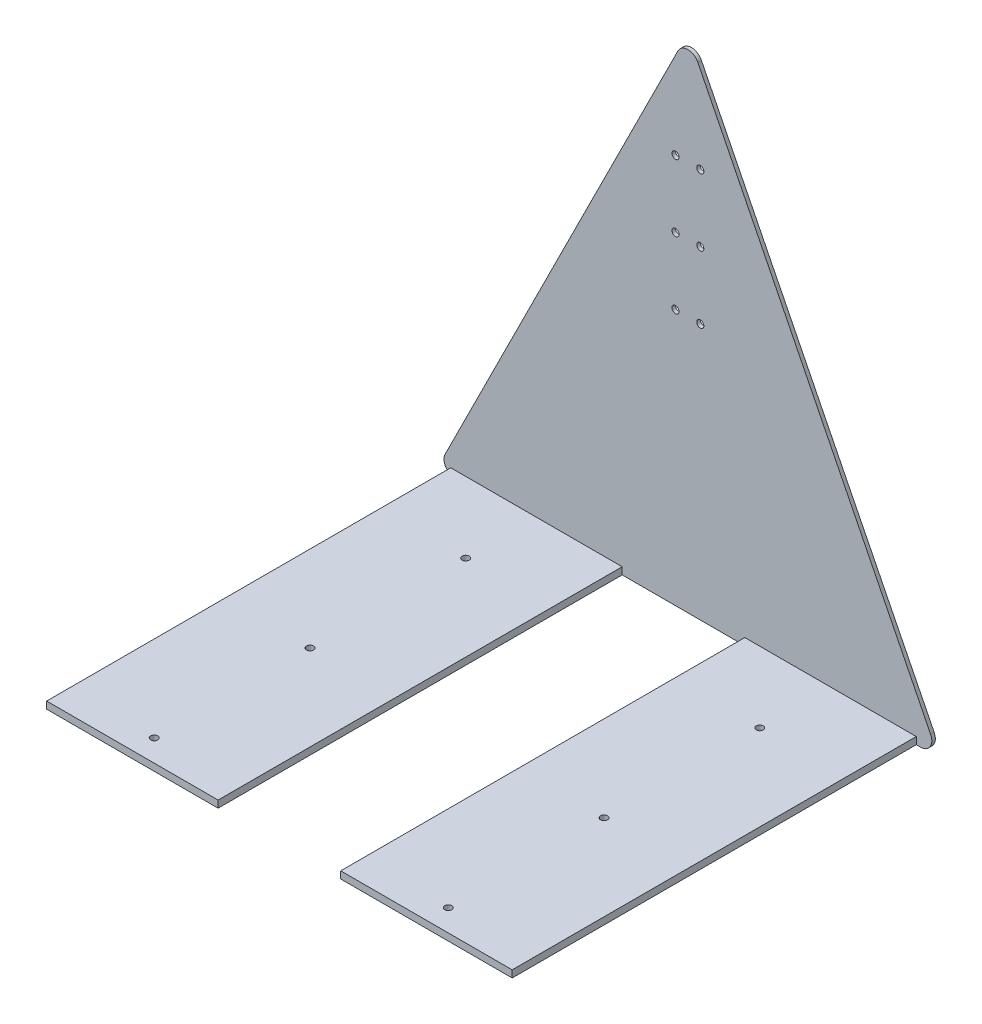
ISO-10303-21;
HEADER;
FILE_DESCRIPTION(('STEP AP214'),'2;1');
FILE_NAME('part.step','',(''),(''),'','','');
FILE_SCHEMA(('AUTOMOTIVE_DESIGN { 1 0 10303 214 1 1 1 1 }'));
ENDSEC;
DATA;
#1=APPLICATION_CONTEXT('core data for automotive mechanical design processes');
#2=APPLICATION_PROTOCOL_DEFINITION('international standard','automotive_design',2000,#1);
#3=PRODUCT_CONTEXT('',#1,'mechanical');
#4=PRODUCT('Part','Part','',(#3));
#5=PRODUCT_RELATED_PRODUCT_CATEGORY('part','',(#4));
#6=PRODUCT_DEFINITION_FORMATION('','',#4);
#7=PRODUCT_DEFINITION_CONTEXT('part definition',#1,'design');
#8=PRODUCT_DEFINITION('design','',#6,#7);
#9=PRODUCT_DEFINITION_SHAPE('','',#8);
#10=(LENGTH_UNIT() NAMED_UNIT(*) SI_UNIT(.MILLI.,.METRE.));
#11=(NAMED_UNIT(*) PLANE_ANGLE_UNIT() SI_UNIT($,.RADIAN.));
#12=(NAMED_UNIT(*) SI_UNIT($,.STERADIAN.) SOLID_ANGLE_UNIT());
#13=UNCERTAINTY_MEASURE_WITH_UNIT(LENGTH_MEASURE(1.E-05),#10,'distance_accuracy_value','');
#14=(GEOMETRIC_REPRESENTATION_CONTEXT(3) GLOBAL_UNCERTAINTY_ASSIGNED_CONTEXT((#13)) GLOBAL_UNIT_ASSIGNED_CONTEXT((#10,
#11,#12)) REPRESENTATION_CONTEXT('',''));
#15=CARTESIAN_POINT('',(0.,0.,0.));
#16=DIRECTION('',(0.,0.,1.));
#17=DIRECTION('',(1.,0.,0.));
#18=AXIS2_PLACEMENT_3D('',#15,#16,#17);
#19=CARTESIAN_POINT('',(-132.886938071488,3238.5595834706,6223.61959782082));
#20=DIRECTION('',(0.,0.,-1.));
#21=DIRECTION('',(-1.,0.,0.));
#22=AXIS2_PLACEMENT_3D('',#19,#20,#21);
#23=PLANE('',#22);
#24=CARTESIAN_POINT('',(-110.661938071488,2843.26974466307,6223.61959782082));
#25=DIRECTION('',(0.,0.,1.));
#26=DIRECTION('',(1.,0.,0.));
#27=AXIS2_PLACEMENT_3D('',#24,#25,#26);
#28=CIRCLE('',#27,6.34999999999995);
#29=CARTESIAN_POINT('',(-104.311938071488,2843.26974466307,6223.61959782082));
#30=VERTEX_POINT('',#29);
#31=EDGE_CURVE('E264',#30,#30,#28,.T.);
#32=ORIENTED_EDGE('',*,*,#31,.F.);
#33=EDGE_LOOP('',(#32));
#34=FACE_BOUND('',#33,.T.);
#35=CARTESIAN_POINT('',(-110.661938071488,2963.26974466307,6223.61959782082));
#36=DIRECTION('',(0.,0.,1.));
#37=DIRECTION('',(1.,0.,0.));
#38=AXIS2_PLACEMENT_3D('',#35,#36,#37);
#39=CIRCLE('',#38,6.34999999999995);
#40=CARTESIAN_POINT('',(-104.311938071488,2963.26974466307,6223.61959782082));
#41=VERTEX_POINT('',#40);
#42=EDGE_CURVE('E272',#41,#41,#39,.T.);
#43=ORIENTED_EDGE('',*,*,#42,.F.);
#44=EDGE_LOOP('',(#43));
#45=FACE_BOUND('',#44,.T.);
#46=CARTESIAN_POINT('',(-110.661938071488,3083.26974466307,6223.61959782082));
#47=DIRECTION('',(0.,0.,1.));
#48=DIRECTION('',(1.,0.,0.));
#49=AXIS2_PLACEMENT_3D('',#46,#47,#48);
#50=CIRCLE('',#49,6.34999999999996);
#51=CARTESIAN_POINT('',(-104.311938071488,3083.26974466307,6223.61959782082));
#52=VERTEX_POINT('',#51);
#53=EDGE_CURVE('E280',#52,#52,#50,.T.);
#54=ORIENTED_EDGE('',*,*,#53,.F.);
#55=EDGE_LOOP('',(#54));
#56=FACE_BOUND('',#55,.T.);
#57=CARTESIAN_POINT('',(-155.111938071488,3083.26974466307,6223.61959782082));
#58=DIRECTION('',(0.,0.,1.));
#59=DIRECTION('',(1.,0.,0.));
#60=AXIS2_PLACEMENT_3D('',#57,#58,#59);
#61=CIRCLE('',#60,6.34999999999997);
#62=CARTESIAN_POINT('',(-148.761938071488,3083.26974466307,6223.61959782082));
#63=VERTEX_POINT('',#62);
#64=EDGE_CURVE('E288',#63,#63,#61,.T.);
#65=ORIENTED_EDGE('',*,*,#64,.F.);
#66=EDGE_LOOP('',(#65));
#67=FACE_BOUND('',#66,.T.);
#68=CARTESIAN_POINT('',(-155.111938071488,2963.26974466307,6223.61959782082));
#69=DIRECTION('',(0.,0.,1.));
#70=DIRECTION('',(1.,0.,0.));
#71=AXIS2_PLACEMENT_3D('',#68,#69,#70);
#72=CIRCLE('',#71,6.34999999999997);
#73=CARTESIAN_POINT('',(-148.761938071488,2963.26974466307,6223.61959782082));
#74=VERTEX_POINT('',#73);
#75=EDGE_CURVE('E296',#74,#74,#72,.T.);
#76=ORIENTED_EDGE('',*,*,#75,.F.);
#77=EDGE_LOOP('',(#76));
#78=FACE_BOUND('',#77,.T.);
#79=CARTESIAN_POINT('',(-155.111938071488,2843.26974466307,6223.61959782082));
#80=DIRECTION('',(0.,0.,1.));
#81=DIRECTION('',(1.,0.,0.));
#82=AXIS2_PLACEMENT_3D('',#79,#80,#81);
#83=CIRCLE('',#82,6.34999999999999);
#84=CARTESIAN_POINT('',(-148.761938071488,2843.26974466307,6223.61959782082));
#85=VERTEX_POINT('',#84);
#86=EDGE_CURVE('E304',#85,#85,#83,.T.);
#87=ORIENTED_EDGE('',*,*,#86,.F.);
#88=EDGE_LOOP('',(#87));
#89=FACE_BOUND('',#88,.T.);
#90=DIRECTION('',(1.,0.,0.));
#91=VECTOR('',#90,1.);
#92=CARTESIAN_POINT('',(276.840185721219,2395.96974466307,6223.61959782082));
#93=LINE('',#92,#91);
#94=CARTESIAN_POINT('',(-30.799814278781,2395.96974466307,6223.61959782082));
#95=VERTEX_POINT('',#94);
#96=CARTESIAN_POINT('',(276.840185721219,2395.96974466307,6223.61959782082));
#97=VERTEX_POINT('',#96);
#98=EDGE_CURVE('E60',#95,#97,#93,.T.);
#99=ORIENTED_EDGE('',*,*,#98,.T.);
#100=DIRECTION('',(0.,-1.,0.));
#101=VECTOR('',#100,1.);
#102=CARTESIAN_POINT('',(276.840185721219,2395.96974466307,6223.61959782082));
#103=LINE('',#102,#101);
#104=CARTESIAN_POINT('',(276.840185721219,2383.26974466307,6223.61959782082));
#105=VERTEX_POINT('',#104);
#106=EDGE_CURVE('E166',#97,#105,#103,.T.);
#107=ORIENTED_EDGE('',*,*,#106,.T.);
#108=DIRECTION('',(1.,0.,0.));
#109=VECTOR('',#108,1.);
#110=CARTESIAN_POINT('',(-550.504061864195,2383.26974466307,6223.61959782082));
#111=LINE('',#110,#109);
#112=CARTESIAN_POINT('',(284.730185721219,2383.26974466307,6223.61959782082));
#113=VERTEX_POINT('',#112);
#114=EDGE_CURVE('E325',#105,#113,#111,.T.);
#115=ORIENTED_EDGE('',*,*,#114,.T.);
#116=CARTESIAN_POINT('',(284.730185721219,2403.26974466307,6223.61959782082));
#117=DIRECTION('',(0.,0.,1.));
#118=DIRECTION('',(1.,0.,0.));
#119=AXIS2_PLACEMENT_3D('',#116,#117,#118);
#120=CIRCLE('',#119,20.);
#121=CARTESIAN_POINT('',(302.618967646059,2412.21354034754,6223.61959782082));
#122=VERTEX_POINT('',#121);
#123=EDGE_CURVE('E329',#113,#122,#120,.T.);
#124=ORIENTED_EDGE('',*,*,#123,.T.);
#125=DIRECTION('',(-0.4471897842234,0.894439096242013,0.));
#126=VECTOR('',#125,1.);
#127=CARTESIAN_POINT('',(302.618967646059,2412.21354034754,6223.61959782082));
#128=LINE('',#127,#126);
#129=CARTESIAN_POINT('',(-114.998156146648,3247.50337915507,6223.61959782082));
#130=VERTEX_POINT('',#129);
#131=EDGE_CURVE('E332',#122,#130,#128,.T.);
#132=ORIENTED_EDGE('',*,*,#131,.T.);
#133=CARTESIAN_POINT('',(-132.886938071488,3238.5595834706,6223.61959782082));
#134=DIRECTION('',(0.,0.,1.));
#135=DIRECTION('',(-1.,0.,0.));
#136=AXIS2_PLACEMENT_3D('',#133,#134,#135);
#137=CIRCLE('',#136,19.9999999999999);
#138=CARTESIAN_POINT('',(-150.775719996328,3247.50337915507,6223.61959782082));
#139=VERTEX_POINT('',#138);
#140=EDGE_CURVE('E312',#130,#139,#137,.T.);
#141=ORIENTED_EDGE('',*,*,#140,.T.);
#142=DIRECTION('',(-0.4471897842234,-0.894439096242013,0.));
#143=VECTOR('',#142,1.);
#144=CARTESIAN_POINT('',(-150.775719996328,3247.50337915507,6223.61959782082));
#145=LINE('',#144,#143);
#146=CARTESIAN_POINT('',(-568.392843789035,2412.21354034754,6223.61959782082));
#147=VERTEX_POINT('',#146);
#148=EDGE_CURVE('E316',#139,#147,#145,.T.);
#149=ORIENTED_EDGE('',*,*,#148,.T.);
#150=CARTESIAN_POINT('',(-550.504061864195,2403.26974466307,6223.61959782082));
#151=DIRECTION('',(0.,0.,1.));
#152=DIRECTION('',(-1.,0.,0.));
#153=AXIS2_PLACEMENT_3D('',#150,#151,#152);
#154=CIRCLE('',#153,19.9999999999999);
#155=CARTESIAN_POINT('',(-558.439814278781,2384.91153577401,6223.61959782082));
#156=VERTEX_POINT('',#155);
#157=EDGE_CURVE('E321',#147,#156,#154,.T.);
#158=ORIENTED_EDGE('',*,*,#157,.T.);
#159=DIRECTION('',(0.,-1.,0.));
#160=VECTOR('',#159,1.);
#161=CARTESIAN_POINT('',(-558.439814278781,2395.96974466307,6223.61959782082));
#162=LINE('',#161,#160);
#163=CARTESIAN_POINT('',(-558.439814278781,2395.96974466307,6223.61959782082));
#164=VERTEX_POINT('',#163);
#165=EDGE_CURVE('E254',#164,#156,#162,.T.);
#166=ORIENTED_EDGE('',*,*,#165,.F.);
#167=DIRECTION('',(1.,0.,0.));
#168=VECTOR('',#167,1.);
#169=CARTESIAN_POINT('',(-250.799814278781,2395.96974466307,6223.61959782082));
#170=LINE('',#169,#168);
#171=CARTESIAN_POINT('',(-250.799814278781,2395.96974466307,6223.61959782082));
#172=VERTEX_POINT('',#171);
#173=EDGE_CURVE('E230',#164,#172,#170,.T.);
#174=ORIENTED_EDGE('',*,*,#173,.T.);
#175=DIRECTION('',(0.,-1.,0.));
#176=VECTOR('',#175,1.);
#177=CARTESIAN_POINT('',(-250.799814278781,2395.96974466307,6223.61959782082));
#178=LINE('',#177,#176);
#179=CARTESIAN_POINT('',(-250.799814278781,2383.26974466307,6223.61959782082));
#180=VERTEX_POINT('',#179);
#181=EDGE_CURVE('E249',#172,#180,#178,.T.);
#182=ORIENTED_EDGE('',*,*,#181,.T.);
#183=CARTESIAN_POINT('',(-30.799814278781,2383.26974466307,6223.61959782082));
#184=VERTEX_POINT('',#183);
#185=EDGE_CURVE('E326',#180,#184,#111,.T.);
#186=ORIENTED_EDGE('',*,*,#185,.T.);
#187=DIRECTION('',(0.,-1.,0.));
#188=VECTOR('',#187,1.);
#189=CARTESIAN_POINT('',(-30.799814278781,2395.96974466307,6223.61959782082));
#190=LINE('',#189,#188);
#191=EDGE_CURVE('E55',#95,#184,#190,.T.);
#192=ORIENTED_EDGE('',*,*,#191,.F.);
#193=EDGE_LOOP('',(#99,#107,#115,#124,#132,#141,#149,#158,#166,#174,#182,#186,#192));
#194=FACE_BOUND('',#193,.T.);
#195=ADVANCED_FACE('F39',(#34,#45,#56,#67,#78,#89,#194),#23,.F.);
#196=CARTESIAN_POINT('',(-132.886938071488,3238.5595834706,6217.26959782082));
#197=DIRECTION('',(0.,0.,-1.));
#198=DIRECTION('',(-1.,0.,0.));
#199=AXIS2_PLACEMENT_3D('',#196,#197,#198);
#200=PLANE('',#199);
#201=CARTESIAN_POINT('',(-110.661938071488,2963.26974466307,6217.26959782082));
#202=DIRECTION('',(0.,0.,1.));
#203=DIRECTION('',(1.,0.,0.));
#204=AXIS2_PLACEMENT_3D('',#201,#202,#203);
#205=CIRCLE('',#204,6.34999999999995);
#206=CARTESIAN_POINT('',(-104.311938071488,2963.26974466307,6217.26959782082));
#207=VERTEX_POINT('',#206);
#208=EDGE_CURVE('E268',#207,#207,#205,.T.);
#209=ORIENTED_EDGE('',*,*,#208,.T.);
#210=EDGE_LOOP('',(#209));
#211=FACE_BOUND('',#210,.T.);
#212=CARTESIAN_POINT('',(-155.111938071488,3083.26974466307,6217.26959782082));
#213=DIRECTION('',(0.,0.,1.));
#214=DIRECTION('',(1.,0.,0.));
#215=AXIS2_PLACEMENT_3D('',#212,#213,#214);
#216=CIRCLE('',#215,6.34999999999997);
#217=CARTESIAN_POINT('',(-148.761938071488,3083.26974466307,6217.26959782082));
#218=VERTEX_POINT('',#217);
#219=EDGE_CURVE('E284',#218,#218,#216,.T.);
#220=ORIENTED_EDGE('',*,*,#219,.T.);
#221=EDGE_LOOP('',(#220));
#222=FACE_BOUND('',#221,.T.);
#223=CARTESIAN_POINT('',(-155.111938071488,2843.26974466307,6217.26959782082));
#224=DIRECTION('',(0.,0.,1.));
#225=DIRECTION('',(1.,0.,0.));
#226=AXIS2_PLACEMENT_3D('',#223,#224,#225);
#227=CIRCLE('',#226,6.34999999999999);
#228=CARTESIAN_POINT('',(-148.761938071488,2843.26974466307,6217.26959782082));
#229=VERTEX_POINT('',#228);
#230=EDGE_CURVE('E300',#229,#229,#227,.T.);
#231=ORIENTED_EDGE('',*,*,#230,.T.);
#232=EDGE_LOOP('',(#231));
#233=FACE_BOUND('',#232,.T.);
#234=CARTESIAN_POINT('',(-132.886938071488,3238.5595834706,6217.26959782082));
#235=DIRECTION('',(0.,0.,1.));
#236=DIRECTION('',(-1.,0.,0.));
#237=AXIS2_PLACEMENT_3D('',#234,#235,#236);
#238=CIRCLE('',#237,19.9999999999999);
#239=CARTESIAN_POINT('',(-114.998156146648,3247.50337915507,6217.26959782082));
#240=VERTEX_POINT('',#239);
#241=CARTESIAN_POINT('',(-150.775719996328,3247.50337915507,6217.26959782082));
#242=VERTEX_POINT('',#241);
#243=EDGE_CURVE('E308',#240,#242,#238,.T.);
#244=ORIENTED_EDGE('',*,*,#243,.F.);
#245=DIRECTION('',(-0.4471897842234,0.894439096242013,0.));
#246=VECTOR('',#245,1.);
#247=CARTESIAN_POINT('',(302.618967646059,2412.21354034754,6217.26959782082));
#248=LINE('',#247,#246);
#249=CARTESIAN_POINT('',(302.618967646059,2412.21354034754,6217.26959782082));
#250=VERTEX_POINT('',#249);
#251=EDGE_CURVE('E317',#250,#240,#248,.T.);
#252=ORIENTED_EDGE('',*,*,#251,.F.);
#253=CARTESIAN_POINT('',(284.730185721219,2403.26974466307,6217.26959782082));
#254=DIRECTION('',(0.,0.,1.));
#255=DIRECTION('',(1.,0.,0.));
#256=AXIS2_PLACEMENT_3D('',#253,#254,#255);
#257=CIRCLE('',#256,20.);
#258=CARTESIAN_POINT('',(284.730185721219,2383.26974466307,6217.26959782082));
#259=VERTEX_POINT('',#258);
#260=EDGE_CURVE('E348',#259,#250,#257,.T.);
#261=ORIENTED_EDGE('',*,*,#260,.F.);
#262=DIRECTION('',(1.,0.,0.));
#263=VECTOR('',#262,1.);
#264=CARTESIAN_POINT('',(-550.504061864195,2383.26974466307,6217.26959782082));
#265=LINE('',#264,#263);
#266=CARTESIAN_POINT('',(-550.504061864195,2383.26974466307,6217.26959782082));
#267=VERTEX_POINT('',#266);
#268=EDGE_CURVE('E345',#267,#259,#265,.T.);
#269=ORIENTED_EDGE('',*,*,#268,.F.);
#270=CARTESIAN_POINT('',(-550.504061864195,2403.26974466307,6217.26959782082));
#271=DIRECTION('',(0.,0.,1.));
#272=DIRECTION('',(-1.,0.,0.));
#273=AXIS2_PLACEMENT_3D('',#270,#271,#272);
#274=CIRCLE('',#273,19.9999999999999);
#275=CARTESIAN_POINT('',(-568.392843789035,2412.21354034754,6217.26959782082));
#276=VERTEX_POINT('',#275);
#277=EDGE_CURVE('E342',#276,#267,#274,.T.);
#278=ORIENTED_EDGE('',*,*,#277,.F.);
#279=DIRECTION('',(-0.4471897842234,-0.894439096242013,0.));
#280=VECTOR('',#279,1.);
#281=CARTESIAN_POINT('',(-150.775719996328,3247.50337915507,6217.26959782082));
#282=LINE('',#281,#280);
#283=EDGE_CURVE('E339',#242,#276,#282,.T.);
#284=ORIENTED_EDGE('',*,*,#283,.F.);
#285=EDGE_LOOP('',(#244,#252,#261,#269,#278,#284));
#286=FACE_BOUND('',#285,.T.);
#287=CARTESIAN_POINT('',(-155.111938071488,2963.26974466307,6217.26959782082));
#288=DIRECTION('',(0.,0.,1.));
#289=DIRECTION('',(1.,0.,0.));
#290=AXIS2_PLACEMENT_3D('',#287,#288,#289);
#291=CIRCLE('',#290,6.34999999999997);
#292=CARTESIAN_POINT('',(-148.761938071488,2963.26974466307,6217.26959782082));
#293=VERTEX_POINT('',#292);
#294=EDGE_CURVE('E292',#293,#293,#291,.T.);
#295=ORIENTED_EDGE('',*,*,#294,.T.);
#296=EDGE_LOOP('',(#295));
#297=FACE_BOUND('',#296,.T.);
#298=CARTESIAN_POINT('',(-110.661938071488,3083.26974466307,6217.26959782082));
#299=DIRECTION('',(0.,0.,1.));
#300=DIRECTION('',(1.,0.,0.));
#301=AXIS2_PLACEMENT_3D('',#298,#299,#300);
#302=CIRCLE('',#301,6.34999999999996);
#303=CARTESIAN_POINT('',(-104.311938071488,3083.26974466307,6217.26959782082));
#304=VERTEX_POINT('',#303);
#305=EDGE_CURVE('E276',#304,#304,#302,.T.);
#306=ORIENTED_EDGE('',*,*,#305,.T.);
#307=EDGE_LOOP('',(#306));
#308=FACE_BOUND('',#307,.T.);
#309=CARTESIAN_POINT('',(-110.661938071488,2843.26974466307,6217.26959782082));
#310=DIRECTION('',(0.,0.,1.));
#311=DIRECTION('',(1.,0.,0.));
#312=AXIS2_PLACEMENT_3D('',#309,#310,#311);
#313=CIRCLE('',#312,6.34999999999995);
#314=CARTESIAN_POINT('',(-104.311938071488,2843.26974466307,6217.26959782082));
#315=VERTEX_POINT('',#314);
#316=EDGE_CURVE('E253',#315,#315,#313,.T.);
#317=ORIENTED_EDGE('',*,*,#316,.T.);
#318=EDGE_LOOP('',(#317));
#319=FACE_BOUND('',#318,.T.);
#320=ADVANCED_FACE('F380',(#211,#222,#233,#286,#297,#308,#319),#200,.T.);
#321=CARTESIAN_POINT('',(-132.886938071488,3238.5595834706,6223.61959782082));
#322=DIRECTION('',(0.,0.,-1.));
#323=DIRECTION('',(-1.,0.,0.));
#324=AXIS2_PLACEMENT_3D('',#321,#322,#323);
#325=CYLINDRICAL_SURFACE('',#324,19.9999999999999);
#326=ORIENTED_EDGE('',*,*,#243,.T.);
#327=DIRECTION('',(0.,0.,-1.));
#328=VECTOR('',#327,1.);
#329=CARTESIAN_POINT('',(-150.775719996328,3247.50337915507,6223.61959782082));
#330=LINE('',#329,#328);
#331=EDGE_CURVE('E11',#139,#242,#330,.T.);
#332=ORIENTED_EDGE('',*,*,#331,.F.);
#333=ORIENTED_EDGE('',*,*,#140,.F.);
#334=DIRECTION('',(0.,0.,-1.));
#335=VECTOR('',#334,1.);
#336=CARTESIAN_POINT('',(-114.998156146648,3247.50337915507,6223.61959782082));
#337=LINE('',#336,#335);
#338=EDGE_CURVE('E335',#130,#240,#337,.T.);
#339=ORIENTED_EDGE('',*,*,#338,.T.);
#340=EDGE_LOOP('',(#326,#332,#333,#339));
#341=FACE_BOUND('',#340,.T.);
#342=ADVANCED_FACE('F41',(#341),#325,.T.);
#343=CARTESIAN_POINT('',(-150.775719996328,3247.50337915507,6223.61959782082));
#344=DIRECTION('',(0.894439096242013,-0.4471897842234,0.));
#345=DIRECTION('',(0.4471897842234,0.894439096242013,0.));
#346=AXIS2_PLACEMENT_3D('',#343,#344,#345);
#347=PLANE('',#346);
#348=ORIENTED_EDGE('',*,*,#283,.T.);
#349=DIRECTION('',(0.,0.,-1.));
#350=VECTOR('',#349,1.);
#351=CARTESIAN_POINT('',(-568.392843789035,2412.21354034754,6223.61959782082));
#352=LINE('',#351,#350);
#353=EDGE_CURVE('E48',#147,#276,#352,.T.);
#354=ORIENTED_EDGE('',*,*,#353,.F.);
#355=ORIENTED_EDGE('',*,*,#148,.F.);
#356=ORIENTED_EDGE('',*,*,#331,.T.);
#357=EDGE_LOOP('',(#348,#354,#355,#356));
#358=FACE_BOUND('',#357,.T.);
#359=ADVANCED_FACE('F407',(#358),#347,.F.);
#360=CARTESIAN_POINT('',(-550.504061864195,2403.26974466307,6223.61959782082));
#361=DIRECTION('',(0.,0.,-1.));
#362=DIRECTION('',(-1.,0.,0.));
#363=AXIS2_PLACEMENT_3D('',#360,#361,#362);
#364=CYLINDRICAL_SURFACE('',#363,19.9999999999999);
#365=ORIENTED_EDGE('',*,*,#277,.T.);
#366=DIRECTION('',(0.,0.,-1.));
#367=VECTOR('',#366,1.);
#368=CARTESIAN_POINT('',(-550.504061864195,2383.26974466307,6223.61959782082));
#369=LINE('',#368,#367);
#370=CARTESIAN_POINT('',(-550.504061864195,2383.26974466307,6223.61959782082));
#371=VERTEX_POINT('',#370);
#372=EDGE_CURVE('E364',#371,#267,#369,.T.);
#373=ORIENTED_EDGE('',*,*,#372,.F.);
#374=EDGE_CURVE('E320',#156,#371,#154,.T.);
#375=ORIENTED_EDGE('',*,*,#374,.F.);
#376=ORIENTED_EDGE('',*,*,#157,.F.);
#377=ORIENTED_EDGE('',*,*,#353,.T.);
#378=EDGE_LOOP('',(#365,#373,#375,#376,#377));
#379=FACE_BOUND('',#378,.T.);
#380=ADVANCED_FACE('F373',(#379),#364,.T.);
#381=CARTESIAN_POINT('',(-550.504061864195,2383.26974466307,6223.61959782082));
#382=DIRECTION('',(0.,1.,0.));
#383=DIRECTION('',(0.,0.,1.));
#384=AXIS2_PLACEMENT_3D('',#381,#382,#383);
#385=PLANE('',#384);
#386=ORIENTED_EDGE('',*,*,#268,.T.);
#387=DIRECTION('',(0.,0.,-1.));
#388=VECTOR('',#387,1.);
#389=CARTESIAN_POINT('',(284.730185721219,2383.26974466307,6223.61959782082));
#390=LINE('',#389,#388);
#391=EDGE_CURVE('E360',#113,#259,#390,.T.);
#392=ORIENTED_EDGE('',*,*,#391,.F.);
#393=ORIENTED_EDGE('',*,*,#114,.F.);
#394=DIRECTION('',(0.,0.,1.));
#395=VECTOR('',#394,1.);
#396=CARTESIAN_POINT('',(276.840185721219,2383.26974466307,6223.61959782082));
#397=LINE('',#396,#395);
#398=CARTESIAN_POINT('',(276.840185721219,2383.26974466307,6948.61959782082));
#399=VERTEX_POINT('',#398);
#400=EDGE_CURVE('E181',#105,#399,#397,.T.);
#401=ORIENTED_EDGE('',*,*,#400,.T.);
#402=DIRECTION('',(-1.,0.,0.));
#403=VECTOR('',#402,1.);
#404=CARTESIAN_POINT('',(276.840185721219,2383.26974466307,6948.61959782082));
#405=LINE('',#404,#403);
#406=CARTESIAN_POINT('',(-30.799814278781,2383.26974466307,6948.61959782082));
#407=VERTEX_POINT('',#406);
#408=EDGE_CURVE('E149',#399,#407,#405,.T.);
#409=ORIENTED_EDGE('',*,*,#408,.T.);
#410=DIRECTION('',(0.,0.,-1.));
#411=VECTOR('',#410,1.);
#412=CARTESIAN_POINT('',(-30.799814278781,2383.26974466307,6223.61959782082));
#413=LINE('',#412,#411);
#414=EDGE_CURVE('E168',#407,#184,#413,.T.);
#415=ORIENTED_EDGE('',*,*,#414,.T.);
#416=ORIENTED_EDGE('',*,*,#185,.F.);
#417=DIRECTION('',(0.,0.,1.));
#418=VECTOR('',#417,1.);
#419=CARTESIAN_POINT('',(-250.799814278781,2383.26974466307,6223.61959782082));
#420=LINE('',#419,#418);
#421=CARTESIAN_POINT('',(-250.799814278781,2383.26974466307,6948.61959782082));
#422=VERTEX_POINT('',#421);
#423=EDGE_CURVE('E214',#180,#422,#420,.T.);
#424=ORIENTED_EDGE('',*,*,#423,.T.);
#425=DIRECTION('',(-1.,0.,0.));
#426=VECTOR('',#425,1.);
#427=CARTESIAN_POINT('',(-250.799814278781,2383.26974466307,6948.61959782082));
#428=LINE('',#427,#426);
#429=CARTESIAN_POINT('',(-558.439814278781,2383.26974466307,6948.61959782082));
#430=VERTEX_POINT('',#429);
#431=EDGE_CURVE('E238',#422,#430,#428,.T.);
#432=ORIENTED_EDGE('',*,*,#431,.T.);
#433=DIRECTION('',(0.,0.,-1.));
#434=VECTOR('',#433,1.);
#435=CARTESIAN_POINT('',(-558.439814278781,2383.26974466307,6223.61959782082));
#436=LINE('',#435,#434);
#437=CARTESIAN_POINT('',(-558.439814278781,2383.26974466307,6223.61959782082));
#438=VERTEX_POINT('',#437);
#439=EDGE_CURVE('E242',#430,#438,#436,.T.);
#440=ORIENTED_EDGE('',*,*,#439,.T.);
#441=DIRECTION('',(1.,0.,0.));
#442=VECTOR('',#441,1.);
#443=CARTESIAN_POINT('',(-250.799814278781,2383.26974466307,6223.61959782082));
#444=LINE('',#443,#442);
#445=EDGE_CURVE('E223',#438,#371,#444,.T.);
#446=ORIENTED_EDGE('',*,*,#445,.T.);
#447=ORIENTED_EDGE('',*,*,#372,.T.);
#448=EDGE_LOOP('',(#386,#392,#393,#401,#409,#415,#416,#424,#432,#440,#446,#447));
#449=FACE_BOUND('',#448,.T.);
#450=CARTESIAN_POINT('',(-404.619814278781,2383.26974466307,6350.61959782082));
#451=DIRECTION('',(0.,-1.,0.));
#452=DIRECTION('',(0.,0.,-1.));
#453=AXIS2_PLACEMENT_3D('',#450,#451,#452);
#454=CIRCLE('',#453,6.35000000000006);
#455=CARTESIAN_POINT('',(-404.619814278781,2383.26974466307,6344.26959782082));
#456=VERTEX_POINT('',#455);
#457=EDGE_CURVE('E189',#456,#456,#454,.T.);
#458=ORIENTED_EDGE('',*,*,#457,.F.);
#459=EDGE_LOOP('',(#458));
#460=FACE_BOUND('',#459,.T.);
#461=CARTESIAN_POINT('',(-404.619814278781,2383.26974466307,6630.01959782082));
#462=DIRECTION('',(0.,-1.,0.));
#463=DIRECTION('',(0.,0.,-1.));
#464=AXIS2_PLACEMENT_3D('',#461,#462,#463);
#465=CIRCLE('',#464,6.35000000000001);
#466=CARTESIAN_POINT('',(-404.619814278781,2383.26974466307,6623.66959782082));
#467=VERTEX_POINT('',#466);
#468=EDGE_CURVE('E198',#467,#467,#465,.T.);
#469=ORIENTED_EDGE('',*,*,#468,.F.);
#470=EDGE_LOOP('',(#469));
#471=FACE_BOUND('',#470,.T.);
#472=CARTESIAN_POINT('',(-404.619814278781,2383.26974466307,6909.41959782082));
#473=DIRECTION('',(0.,-1.,0.));
#474=DIRECTION('',(0.,0.,-1.));
#475=AXIS2_PLACEMENT_3D('',#472,#473,#474);
#476=CIRCLE('',#475,6.35000000000001);
#477=CARTESIAN_POINT('',(-404.619814278781,2383.26974466307,6903.06959782082));
#478=VERTEX_POINT('',#477);
#479=EDGE_CURVE('E206',#478,#478,#476,.T.);
#480=ORIENTED_EDGE('',*,*,#479,.F.);
#481=EDGE_LOOP('',(#480));
#482=FACE_BOUND('',#481,.T.);
#483=CARTESIAN_POINT('',(123.020185721219,2383.26974466307,6350.61959782082));
#484=DIRECTION('',(0.,-1.,0.));
#485=DIRECTION('',(0.,0.,-1.));
#486=AXIS2_PLACEMENT_3D('',#483,#484,#485);
#487=CIRCLE('',#486,6.35000000000006);
#488=CARTESIAN_POINT('',(123.020185721219,2383.26974466307,6344.26959782082));
#489=VERTEX_POINT('',#488);
#490=EDGE_CURVE('E510',#489,#489,#487,.T.);
#491=ORIENTED_EDGE('',*,*,#490,.F.);
#492=EDGE_LOOP('',(#491));
#493=FACE_BOUND('',#492,.T.);
#494=CARTESIAN_POINT('',(123.020185721219,2383.26974466307,6630.01959782082));
#495=DIRECTION('',(0.,-1.,0.));
#496=DIRECTION('',(0.,0.,-1.));
#497=AXIS2_PLACEMENT_3D('',#494,#495,#496);
#498=CIRCLE('',#497,6.35000000000001);
#499=CARTESIAN_POINT('',(123.020185721219,2383.26974466307,6623.66959782082));
#500=VERTEX_POINT('',#499);
#501=EDGE_CURVE('E515',#500,#500,#498,.T.);
#502=ORIENTED_EDGE('',*,*,#501,.F.);
#503=EDGE_LOOP('',(#502));
#504=FACE_BOUND('',#503,.T.);
#505=CARTESIAN_POINT('',(123.020185721219,2383.26974466307,6909.41959782082));
#506=DIRECTION('',(0.,-1.,0.));
#507=DIRECTION('',(0.,0.,-1.));
#508=AXIS2_PLACEMENT_3D('',#505,#506,#507);
#509=CIRCLE('',#508,6.35000000000001);
#510=CARTESIAN_POINT('',(123.020185721219,2383.26974466307,6903.06959782082));
#511=VERTEX_POINT('',#510);
#512=EDGE_CURVE('E174',#511,#511,#509,.T.);
#513=ORIENTED_EDGE('',*,*,#512,.F.);
#514=EDGE_LOOP('',(#513));
#515=FACE_BOUND('',#514,.T.);
#516=ADVANCED_FACE('F386',(#449,#460,#471,#482,#493,#504,#515),#385,.F.);
#517=CARTESIAN_POINT('',(284.730185721219,2403.26974466307,6223.61959782082));
#518=DIRECTION('',(0.,0.,-1.));
#519=DIRECTION('',(-1.,0.,0.));
#520=AXIS2_PLACEMENT_3D('',#517,#518,#519);
#521=CYLINDRICAL_SURFACE('',#520,20.);
#522=ORIENTED_EDGE('',*,*,#260,.T.);
#523=DIRECTION('',(0.,0.,-1.));
#524=VECTOR('',#523,1.);
#525=CARTESIAN_POINT('',(302.618967646059,2412.21354034754,6223.61959782082));
#526=LINE('',#525,#524);
#527=EDGE_CURVE('E356',#122,#250,#526,.T.);
#528=ORIENTED_EDGE('',*,*,#527,.F.);
#529=ORIENTED_EDGE('',*,*,#123,.F.);
#530=ORIENTED_EDGE('',*,*,#391,.T.);
#531=EDGE_LOOP('',(#522,#528,#529,#530));
#532=FACE_BOUND('',#531,.T.);
#533=ADVANCED_FACE('F390',(#532),#521,.T.);
#534=CARTESIAN_POINT('',(302.618967646059,2412.21354034754,6223.61959782082));
#535=DIRECTION('',(-0.894439096242013,-0.4471897842234,0.));
#536=DIRECTION('',(0.447189784223401,-0.894439096242013,0.));
#537=AXIS2_PLACEMENT_3D('',#534,#535,#536);
#538=PLANE('',#537);
#539=ORIENTED_EDGE('',*,*,#251,.T.);
#540=ORIENTED_EDGE('',*,*,#338,.F.);
#541=ORIENTED_EDGE('',*,*,#131,.F.);
#542=ORIENTED_EDGE('',*,*,#527,.T.);
#543=EDGE_LOOP('',(#539,#540,#541,#542));
#544=FACE_BOUND('',#543,.T.);
#545=ADVANCED_FACE('F410',(#544),#538,.F.);
#546=CARTESIAN_POINT('',(-155.111938071488,2843.26974466307,6223.61959782082));
#547=DIRECTION('',(0.,0.,-1.));
#548=DIRECTION('',(-1.,0.,0.));
#549=AXIS2_PLACEMENT_3D('',#546,#547,#548);
#550=CYLINDRICAL_SURFACE('',#549,6.34999999999999);
#551=ORIENTED_EDGE('',*,*,#86,.T.);
#552=EDGE_LOOP('',(#551));
#553=FACE_BOUND('',#552,.T.);
#554=ORIENTED_EDGE('',*,*,#230,.F.);
#555=EDGE_LOOP('',(#554));
#556=FACE_BOUND('',#555,.T.);
#557=ADVANCED_FACE('F412',(#553,#556),#550,.F.);
#558=CARTESIAN_POINT('',(-155.111938071488,2963.26974466307,6223.61959782082));
#559=DIRECTION('',(0.,0.,-1.));
#560=DIRECTION('',(-1.,0.,0.));
#561=AXIS2_PLACEMENT_3D('',#558,#559,#560);
#562=CYLINDRICAL_SURFACE('',#561,6.34999999999997);
#563=ORIENTED_EDGE('',*,*,#75,.T.);
#564=EDGE_LOOP('',(#563));
#565=FACE_BOUND('',#564,.T.);
#566=ORIENTED_EDGE('',*,*,#294,.F.);
#567=EDGE_LOOP('',(#566));
#568=FACE_BOUND('',#567,.T.);
#569=ADVANCED_FACE('F418',(#565,#568),#562,.F.);
#570=CARTESIAN_POINT('',(-155.111938071488,3083.26974466307,6223.61959782082));
#571=DIRECTION('',(0.,0.,-1.));
#572=DIRECTION('',(-1.,0.,0.));
#573=AXIS2_PLACEMENT_3D('',#570,#571,#572);
#574=CYLINDRICAL_SURFACE('',#573,6.34999999999997);
#575=ORIENTED_EDGE('',*,*,#64,.T.);
#576=EDGE_LOOP('',(#575));
#577=FACE_BOUND('',#576,.T.);
#578=ORIENTED_EDGE('',*,*,#219,.F.);
#579=EDGE_LOOP('',(#578));
#580=FACE_BOUND('',#579,.T.);
#581=ADVANCED_FACE('F435',(#577,#580),#574,.F.);
#582=CARTESIAN_POINT('',(-110.661938071488,3083.26974466307,6223.61959782082));
#583=DIRECTION('',(0.,0.,-1.));
#584=DIRECTION('',(-1.,0.,0.));
#585=AXIS2_PLACEMENT_3D('',#582,#583,#584);
#586=CYLINDRICAL_SURFACE('',#585,6.34999999999996);
#587=ORIENTED_EDGE('',*,*,#53,.T.);
#588=EDGE_LOOP('',(#587));
#589=FACE_BOUND('',#588,.T.);
#590=ORIENTED_EDGE('',*,*,#305,.F.);
#591=EDGE_LOOP('',(#590));
#592=FACE_BOUND('',#591,.T.);
#593=ADVANCED_FACE('F439',(#589,#592),#586,.F.);
#594=CARTESIAN_POINT('',(-110.661938071488,2963.26974466307,6223.61959782082));
#595=DIRECTION('',(0.,0.,-1.));
#596=DIRECTION('',(-1.,0.,0.));
#597=AXIS2_PLACEMENT_3D('',#594,#595,#596);
#598=CYLINDRICAL_SURFACE('',#597,6.34999999999995);
#599=ORIENTED_EDGE('',*,*,#42,.T.);
#600=EDGE_LOOP('',(#599));
#601=FACE_BOUND('',#600,.T.);
#602=ORIENTED_EDGE('',*,*,#208,.F.);
#603=EDGE_LOOP('',(#602));
#604=FACE_BOUND('',#603,.T.);
#605=ADVANCED_FACE('F443',(#601,#604),#598,.F.);
#606=CARTESIAN_POINT('',(-110.661938071488,2843.26974466307,6223.61959782082));
#607=DIRECTION('',(0.,0.,-1.));
#608=DIRECTION('',(-1.,0.,0.));
#609=AXIS2_PLACEMENT_3D('',#606,#607,#608);
#610=CYLINDRICAL_SURFACE('',#609,6.34999999999995);
#611=ORIENTED_EDGE('',*,*,#31,.T.);
#612=EDGE_LOOP('',(#611));
#613=FACE_BOUND('',#612,.T.);
#614=ORIENTED_EDGE('',*,*,#316,.F.);
#615=EDGE_LOOP('',(#614));
#616=FACE_BOUND('',#615,.T.);
#617=ADVANCED_FACE('F447',(#613,#616),#610,.F.);
#618=CARTESIAN_POINT('',(-250.799814278781,2395.96974466307,6223.61959782082));
#619=DIRECTION('',(1.,0.,0.));
#620=DIRECTION('',(0.,0.,-1.));
#621=AXIS2_PLACEMENT_3D('',#618,#619,#620);
#622=PLANE('',#621);
#623=ORIENTED_EDGE('',*,*,#423,.F.);
#624=ORIENTED_EDGE('',*,*,#181,.F.);
#625=DIRECTION('',(0.,0.,1.));
#626=VECTOR('',#625,1.);
#627=CARTESIAN_POINT('',(-250.799814278781,2395.96974466307,6223.61959782082));
#628=LINE('',#627,#626);
#629=CARTESIAN_POINT('',(-250.799814278781,2395.96974466307,6948.61959782082));
#630=VERTEX_POINT('',#629);
#631=EDGE_CURVE('E218',#172,#630,#628,.T.);
#632=ORIENTED_EDGE('',*,*,#631,.T.);
#633=DIRECTION('',(0.,-1.,0.));
#634=VECTOR('',#633,1.);
#635=CARTESIAN_POINT('',(-250.799814278781,2395.96974466307,6948.61959782082));
#636=LINE('',#635,#634);
#637=EDGE_CURVE('E234',#630,#422,#636,.T.);
#638=ORIENTED_EDGE('',*,*,#637,.T.);
#639=EDGE_LOOP('',(#623,#624,#632,#638));
#640=FACE_BOUND('',#639,.T.);
#641=ADVANCED_FACE('F451',(#640),#622,.T.);
#642=CARTESIAN_POINT('',(-250.799814278781,2395.96974466307,6223.61959782082));
#643=DIRECTION('',(0.,0.,-1.));
#644=DIRECTION('',(-1.,0.,0.));
#645=AXIS2_PLACEMENT_3D('',#642,#643,#644);
#646=PLANE('',#645);
#647=EDGE_CURVE('E258',#156,#438,#162,.T.);
#648=ORIENTED_EDGE('',*,*,#647,.F.);
#649=ORIENTED_EDGE('',*,*,#374,.T.);
#650=ORIENTED_EDGE('',*,*,#445,.F.);
#651=EDGE_LOOP('',(#648,#649,#650));
#652=FACE_BOUND('',#651,.T.);
#653=ADVANCED_FACE('F404',(#652),#646,.T.);
#654=CARTESIAN_POINT('',(-558.439814278781,2395.96974466307,6223.61959782082));
#655=DIRECTION('',(-1.,0.,0.));
#656=DIRECTION('',(0.,0.,1.));
#657=AXIS2_PLACEMENT_3D('',#654,#655,#656);
#658=PLANE('',#657);
#659=ORIENTED_EDGE('',*,*,#439,.F.);
#660=DIRECTION('',(0.,-1.,0.));
#661=VECTOR('',#660,1.);
#662=CARTESIAN_POINT('',(-558.439814278781,2395.96974466307,6948.61959782082));
#663=LINE('',#662,#661);
#664=CARTESIAN_POINT('',(-558.439814278781,2395.96974466307,6948.61959782082));
#665=VERTEX_POINT('',#664);
#666=EDGE_CURVE('E259',#665,#430,#663,.T.);
#667=ORIENTED_EDGE('',*,*,#666,.F.);
#668=DIRECTION('',(0.,0.,-1.));
#669=VECTOR('',#668,1.);
#670=CARTESIAN_POINT('',(-558.439814278781,2395.96974466307,6223.61959782082));
#671=LINE('',#670,#669);
#672=EDGE_CURVE('E227',#665,#164,#671,.T.);
#673=ORIENTED_EDGE('',*,*,#672,.T.);
#674=ORIENTED_EDGE('',*,*,#165,.T.);
#675=ORIENTED_EDGE('',*,*,#647,.T.);
#676=EDGE_LOOP('',(#659,#667,#673,#674,#675));
#677=FACE_BOUND('',#676,.T.);
#678=ADVANCED_FACE('F399',(#677),#658,.T.);
#679=CARTESIAN_POINT('',(-250.799814278781,2395.96974466307,6948.61959782082));
#680=DIRECTION('',(0.,0.,1.));
#681=DIRECTION('',(1.,0.,0.));
#682=AXIS2_PLACEMENT_3D('',#679,#680,#681);
#683=PLANE('',#682);
#684=ORIENTED_EDGE('',*,*,#431,.F.);
#685=ORIENTED_EDGE('',*,*,#637,.F.);
#686=DIRECTION('',(-1.,0.,0.));
#687=VECTOR('',#686,1.);
#688=CARTESIAN_POINT('',(-250.799814278781,2395.96974466307,6948.61959782082));
#689=LINE('',#688,#687);
#690=EDGE_CURVE('E222',#630,#665,#689,.T.);
#691=ORIENTED_EDGE('',*,*,#690,.T.);
#692=ORIENTED_EDGE('',*,*,#666,.T.);
#693=EDGE_LOOP('',(#684,#685,#691,#692));
#694=FACE_BOUND('',#693,.T.);
#695=ADVANCED_FACE('F456',(#694),#683,.T.);
#696=CARTESIAN_POINT('',(-132.886938071488,2395.96974466307,6217.26959782082));
#697=DIRECTION('',(0.,-1.,0.));
#698=DIRECTION('',(0.,0.,-1.));
#699=AXIS2_PLACEMENT_3D('',#696,#697,#698);
#700=PLANE('',#699);
#701=CARTESIAN_POINT('',(-404.619814278781,2395.96974466307,6350.61959782082));
#702=DIRECTION('',(0.,-1.,0.));
#703=DIRECTION('',(0.,0.,-1.));
#704=AXIS2_PLACEMENT_3D('',#701,#702,#703);
#705=CIRCLE('',#704,6.35000000000006);
#706=CARTESIAN_POINT('',(-404.619814278781,2395.96974466307,6344.26959782082));
#707=VERTEX_POINT('',#706);
#708=EDGE_CURVE('E194',#707,#707,#705,.T.);
#709=ORIENTED_EDGE('',*,*,#708,.T.);
#710=EDGE_LOOP('',(#709));
#711=FACE_BOUND('',#710,.T.);
#712=CARTESIAN_POINT('',(-404.619814278781,2395.96974466307,6630.01959782082));
#713=DIRECTION('',(0.,-1.,0.));
#714=DIRECTION('',(0.,0.,-1.));
#715=AXIS2_PLACEMENT_3D('',#712,#713,#714);
#716=CIRCLE('',#715,6.35000000000001);
#717=CARTESIAN_POINT('',(-404.619814278781,2395.96974466307,6623.66959782082));
#718=VERTEX_POINT('',#717);
#719=EDGE_CURVE('E202',#718,#718,#716,.T.);
#720=ORIENTED_EDGE('',*,*,#719,.T.);
#721=EDGE_LOOP('',(#720));
#722=FACE_BOUND('',#721,.T.);
#723=CARTESIAN_POINT('',(-404.619814278781,2395.96974466307,6909.41959782082));
#724=DIRECTION('',(0.,-1.,0.));
#725=DIRECTION('',(0.,0.,-1.));
#726=AXIS2_PLACEMENT_3D('',#723,#724,#725);
#727=CIRCLE('',#726,6.35000000000001);
#728=CARTESIAN_POINT('',(-404.619814278781,2395.96974466307,6903.06959782082));
#729=VERTEX_POINT('',#728);
#730=EDGE_CURVE('E210',#729,#729,#727,.T.);
#731=ORIENTED_EDGE('',*,*,#730,.T.);
#732=EDGE_LOOP('',(#731));
#733=FACE_BOUND('',#732,.T.);
#734=ORIENTED_EDGE('',*,*,#631,.F.);
#735=ORIENTED_EDGE('',*,*,#173,.F.);
#736=ORIENTED_EDGE('',*,*,#672,.F.);
#737=ORIENTED_EDGE('',*,*,#690,.F.);
#738=EDGE_LOOP('',(#734,#735,#736,#737));
#739=FACE_BOUND('',#738,.T.);
#740=ADVANCED_FACE('F459',(#711,#722,#733,#739),#700,.F.);
#741=CARTESIAN_POINT('',(-404.619814278781,2395.96974466307,6909.41959782082));
#742=DIRECTION('',(0.,-1.,0.));
#743=DIRECTION('',(0.,0.,-1.));
#744=AXIS2_PLACEMENT_3D('',#741,#742,#743);
#745=CYLINDRICAL_SURFACE('',#744,6.35000000000001);
#746=ORIENTED_EDGE('',*,*,#730,.F.);
#747=EDGE_LOOP('',(#746));
#748=FACE_BOUND('',#747,.T.);
#749=ORIENTED_EDGE('',*,*,#479,.T.);
#750=EDGE_LOOP('',(#749));
#751=FACE_BOUND('',#750,.T.);
#752=ADVANCED_FACE('F467',(#748,#751),#745,.F.);
#753=CARTESIAN_POINT('',(-404.619814278781,2395.96974466307,6630.01959782082));
#754=DIRECTION('',(0.,-1.,0.));
#755=DIRECTION('',(0.,0.,-1.));
#756=AXIS2_PLACEMENT_3D('',#753,#754,#755);
#757=CYLINDRICAL_SURFACE('',#756,6.35000000000001);
#758=ORIENTED_EDGE('',*,*,#719,.F.);
#759=EDGE_LOOP('',(#758));
#760=FACE_BOUND('',#759,.T.);
#761=ORIENTED_EDGE('',*,*,#468,.T.);
#762=EDGE_LOOP('',(#761));
#763=FACE_BOUND('',#762,.T.);
#764=ADVANCED_FACE('F471',(#760,#763),#757,.F.);
#765=CARTESIAN_POINT('',(-404.619814278781,2395.96974466307,6350.61959782082));
#766=DIRECTION('',(0.,-1.,0.));
#767=DIRECTION('',(0.,0.,-1.));
#768=AXIS2_PLACEMENT_3D('',#765,#766,#767);
#769=CYLINDRICAL_SURFACE('',#768,6.35000000000006);
#770=ORIENTED_EDGE('',*,*,#708,.F.);
#771=EDGE_LOOP('',(#770));
#772=FACE_BOUND('',#771,.T.);
#773=ORIENTED_EDGE('',*,*,#457,.T.);
#774=EDGE_LOOP('',(#773));
#775=FACE_BOUND('',#774,.T.);
#776=ADVANCED_FACE('F475',(#772,#775),#769,.F.);
#777=CARTESIAN_POINT('',(276.840185721219,2395.96974466307,6223.61959782082));
#778=DIRECTION('',(1.,0.,0.));
#779=DIRECTION('',(0.,0.,-1.));
#780=AXIS2_PLACEMENT_3D('',#777,#778,#779);
#781=PLANE('',#780);
#782=ORIENTED_EDGE('',*,*,#400,.F.);
#783=ORIENTED_EDGE('',*,*,#106,.F.);
#784=DIRECTION('',(0.,0.,1.));
#785=VECTOR('',#784,1.);
#786=CARTESIAN_POINT('',(276.840185721219,2395.96974466307,6223.61959782082));
#787=LINE('',#786,#785);
#788=CARTESIAN_POINT('',(276.840185721219,2395.96974466307,6948.61959782082));
#789=VERTEX_POINT('',#788);
#790=EDGE_CURVE('E161',#97,#789,#787,.T.);
#791=ORIENTED_EDGE('',*,*,#790,.T.);
#792=DIRECTION('',(0.,-1.,0.));
#793=VECTOR('',#792,1.);
#794=CARTESIAN_POINT('',(276.840185721219,2395.96974466307,6948.61959782082));
#795=LINE('',#794,#793);
#796=EDGE_CURVE('E144',#789,#399,#795,.T.);
#797=ORIENTED_EDGE('',*,*,#796,.T.);
#798=EDGE_LOOP('',(#782,#783,#791,#797));
#799=FACE_BOUND('',#798,.T.);
#800=ADVANCED_FACE('F165',(#799),#781,.T.);
#801=CARTESIAN_POINT('',(-30.799814278781,2395.96974466307,6223.61959782082));
#802=DIRECTION('',(-1.,0.,0.));
#803=DIRECTION('',(0.,0.,1.));
#804=AXIS2_PLACEMENT_3D('',#801,#802,#803);
#805=PLANE('',#804);
#806=ORIENTED_EDGE('',*,*,#414,.F.);
#807=DIRECTION('',(0.,-1.,0.));
#808=VECTOR('',#807,1.);
#809=CARTESIAN_POINT('',(-30.799814278781,2395.96974466307,6948.61959782082));
#810=LINE('',#809,#808);
#811=CARTESIAN_POINT('',(-30.799814278781,2395.96974466307,6948.61959782082));
#812=VERTEX_POINT('',#811);
#813=EDGE_CURVE('E155',#812,#407,#810,.T.);
#814=ORIENTED_EDGE('',*,*,#813,.F.);
#815=DIRECTION('',(0.,0.,-1.));
#816=VECTOR('',#815,1.);
#817=CARTESIAN_POINT('',(-30.799814278781,2395.96974466307,6223.61959782082));
#818=LINE('',#817,#816);
#819=EDGE_CURVE('E162',#812,#95,#818,.T.);
#820=ORIENTED_EDGE('',*,*,#819,.T.);
#821=ORIENTED_EDGE('',*,*,#191,.T.);
#822=EDGE_LOOP('',(#806,#814,#820,#821));
#823=FACE_BOUND('',#822,.T.);
#824=ADVANCED_FACE('F482',(#823),#805,.T.);
#825=CARTESIAN_POINT('',(276.840185721219,2395.96974466307,6948.61959782082));
#826=DIRECTION('',(0.,0.,1.));
#827=DIRECTION('',(1.,0.,0.));
#828=AXIS2_PLACEMENT_3D('',#825,#826,#827);
#829=PLANE('',#828);
#830=ORIENTED_EDGE('',*,*,#408,.F.);
#831=ORIENTED_EDGE('',*,*,#796,.F.);
#832=DIRECTION('',(-1.,0.,0.));
#833=VECTOR('',#832,1.);
#834=CARTESIAN_POINT('',(276.840185721219,2395.96974466307,6948.61959782082));
#835=LINE('',#834,#833);
#836=EDGE_CURVE('E147',#789,#812,#835,.T.);
#837=ORIENTED_EDGE('',*,*,#836,.T.);
#838=ORIENTED_EDGE('',*,*,#813,.T.);
#839=EDGE_LOOP('',(#830,#831,#837,#838));
#840=FACE_BOUND('',#839,.T.);
#841=ADVANCED_FACE('F146',(#840),#829,.T.);
#842=CARTESIAN_POINT('',(-132.886938071488,2395.96974466307,6217.26959782082));
#843=DIRECTION('',(0.,-1.,0.));
#844=DIRECTION('',(0.,0.,-1.));
#845=AXIS2_PLACEMENT_3D('',#842,#843,#844);
#846=PLANE('',#845);
#847=CARTESIAN_POINT('',(123.020185721219,2395.96974466307,6350.61959782082));
#848=DIRECTION('',(0.,-1.,0.));
#849=DIRECTION('',(0.,0.,-1.));
#850=AXIS2_PLACEMENT_3D('',#847,#848,#849);
#851=CIRCLE('',#850,6.35000000000006);
#852=CARTESIAN_POINT('',(123.020185721219,2395.96974466307,6344.26959782082));
#853=VERTEX_POINT('',#852);
#854=EDGE_CURVE('E507',#853,#853,#851,.T.);
#855=ORIENTED_EDGE('',*,*,#854,.T.);
#856=EDGE_LOOP('',(#855));
#857=FACE_BOUND('',#856,.T.);
#858=CARTESIAN_POINT('',(123.020185721219,2395.96974466307,6630.01959782082));
#859=DIRECTION('',(0.,-1.,0.));
#860=DIRECTION('',(0.,0.,-1.));
#861=AXIS2_PLACEMENT_3D('',#858,#859,#860);
#862=CIRCLE('',#861,6.35000000000001);
#863=CARTESIAN_POINT('',(123.020185721219,2395.96974466307,6623.66959782082));
#864=VERTEX_POINT('',#863);
#865=EDGE_CURVE('E518',#864,#864,#862,.T.);
#866=ORIENTED_EDGE('',*,*,#865,.T.);
#867=EDGE_LOOP('',(#866));
#868=FACE_BOUND('',#867,.T.);
#869=CARTESIAN_POINT('',(123.020185721219,2395.96974466307,6909.41959782082));
#870=DIRECTION('',(0.,-1.,0.));
#871=DIRECTION('',(0.,0.,-1.));
#872=AXIS2_PLACEMENT_3D('',#869,#870,#871);
#873=CIRCLE('',#872,6.35000000000001);
#874=CARTESIAN_POINT('',(123.020185721219,2395.96974466307,6903.06959782082));
#875=VERTEX_POINT('',#874);
#876=EDGE_CURVE('E184',#875,#875,#873,.T.);
#877=ORIENTED_EDGE('',*,*,#876,.T.);
#878=EDGE_LOOP('',(#877));
#879=FACE_BOUND('',#878,.T.);
#880=ORIENTED_EDGE('',*,*,#790,.F.);
#881=ORIENTED_EDGE('',*,*,#98,.F.);
#882=ORIENTED_EDGE('',*,*,#819,.F.);
#883=ORIENTED_EDGE('',*,*,#836,.F.);
#884=EDGE_LOOP('',(#880,#881,#882,#883));
#885=FACE_BOUND('',#884,.T.);
#886=ADVANCED_FACE('F160',(#857,#868,#879,#885),#846,.F.);
#887=CARTESIAN_POINT('',(123.020185721219,2395.96974466307,6909.41959782082));
#888=DIRECTION('',(0.,-1.,0.));
#889=DIRECTION('',(0.,0.,-1.));
#890=AXIS2_PLACEMENT_3D('',#887,#888,#889);
#891=CYLINDRICAL_SURFACE('',#890,6.35000000000001);
#892=ORIENTED_EDGE('',*,*,#876,.F.);
#893=EDGE_LOOP('',(#892));
#894=FACE_BOUND('',#893,.T.);
#895=ORIENTED_EDGE('',*,*,#512,.T.);
#896=EDGE_LOOP('',(#895));
#897=FACE_BOUND('',#896,.T.);
#898=ADVANCED_FACE('F490',(#894,#897),#891,.F.);
#899=CARTESIAN_POINT('',(123.020185721219,2395.96974466307,6630.01959782082));
#900=DIRECTION('',(0.,-1.,0.));
#901=DIRECTION('',(0.,0.,-1.));
#902=AXIS2_PLACEMENT_3D('',#899,#900,#901);
#903=CYLINDRICAL_SURFACE('',#902,6.35000000000001);
#904=ORIENTED_EDGE('',*,*,#865,.F.);
#905=EDGE_LOOP('',(#904));
#906=FACE_BOUND('',#905,.T.);
#907=ORIENTED_EDGE('',*,*,#501,.T.);
#908=EDGE_LOOP('',(#907));
#909=FACE_BOUND('',#908,.T.);
#910=ADVANCED_FACE('F494',(#906,#909),#903,.F.);
#911=CARTESIAN_POINT('',(123.020185721219,2395.96974466307,6350.61959782082));
#912=DIRECTION('',(0.,-1.,0.));
#913=DIRECTION('',(0.,0.,-1.));
#914=AXIS2_PLACEMENT_3D('',#911,#912,#913);
#915=CYLINDRICAL_SURFACE('',#914,6.35000000000006);
#916=ORIENTED_EDGE('',*,*,#854,.F.);
#917=EDGE_LOOP('',(#916));
#918=FACE_BOUND('',#917,.T.);
#919=ORIENTED_EDGE('',*,*,#490,.T.);
#920=EDGE_LOOP('',(#919));
#921=FACE_BOUND('',#920,.T.);
#922=ADVANCED_FACE('F498',(#918,#921),#915,.F.);
#923=CLOSED_SHELL('',(#195,#320,#342,#359,#380,#516,#533,#545,#557,#569,#581,#593,#605,#617,
#641,#653,#678,#695,#740,#752,#764,#776,#800,#824,#841,#886,#898,#910,#922));
#924=MANIFOLD_SOLID_BREP('B2',#923);
#925=ADVANCED_BREP_SHAPE_REPRESENTATION('',(#18,#924),#14);
#926=SHAPE_DEFINITION_REPRESENTATION(#9,#925);
ENDSEC;
END-ISO-10303-21;
